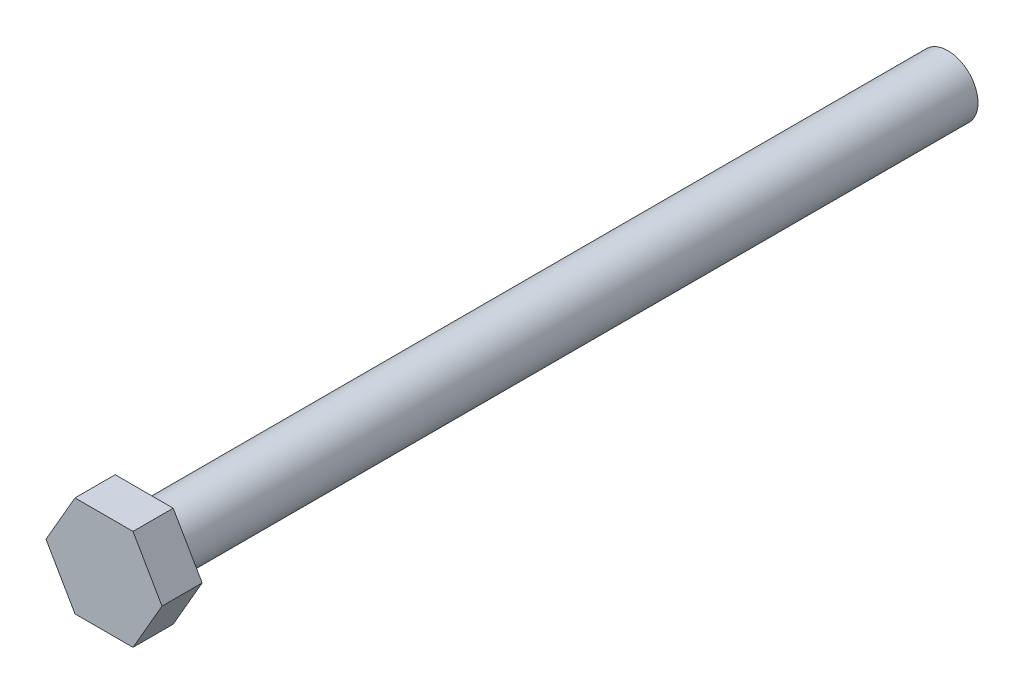
ISO-10303-21;
HEADER;
FILE_DESCRIPTION(('STEP AP214'),'2;1');
FILE_NAME('part.step','',(''),(''),'','','');
FILE_SCHEMA(('AUTOMOTIVE_DESIGN { 1 0 10303 214 1 1 1 1 }'));
ENDSEC;
DATA;
#1=APPLICATION_CONTEXT('core data for automotive mechanical design processes');
#2=APPLICATION_PROTOCOL_DEFINITION('international standard','automotive_design',2000,#1);
#3=PRODUCT_CONTEXT('',#1,'mechanical');
#4=PRODUCT('Part','Part','',(#3));
#5=PRODUCT_RELATED_PRODUCT_CATEGORY('part','',(#4));
#6=PRODUCT_DEFINITION_FORMATION('','',#4);
#7=PRODUCT_DEFINITION_CONTEXT('part definition',#1,'design');
#8=PRODUCT_DEFINITION('design','',#6,#7);
#9=PRODUCT_DEFINITION_SHAPE('','',#8);
#10=(LENGTH_UNIT() NAMED_UNIT(*) SI_UNIT(.MILLI.,.METRE.));
#11=(NAMED_UNIT(*) PLANE_ANGLE_UNIT() SI_UNIT($,.RADIAN.));
#12=(NAMED_UNIT(*) SI_UNIT($,.STERADIAN.) SOLID_ANGLE_UNIT());
#13=UNCERTAINTY_MEASURE_WITH_UNIT(LENGTH_MEASURE(1.E-05),#10,'distance_accuracy_value','');
#14=(GEOMETRIC_REPRESENTATION_CONTEXT(3) GLOBAL_UNCERTAINTY_ASSIGNED_CONTEXT((#13)) GLOBAL_UNIT_ASSIGNED_CONTEXT((#10,
#11,#12)) REPRESENTATION_CONTEXT('',''));
#15=CARTESIAN_POINT('',(0.,0.,0.));
#16=DIRECTION('',(0.,0.,1.));
#17=DIRECTION('',(1.,0.,0.));
#18=AXIS2_PLACEMENT_3D('',#15,#16,#17);
#19=CARTESIAN_POINT('',(0.,0.,-80.));
#20=DIRECTION('',(0.,0.,1.));
#21=DIRECTION('',(1.,0.,0.));
#22=AXIS2_PLACEMENT_3D('',#19,#20,#21);
#23=CYLINDRICAL_SURFACE('',#22,3.);
#24=CARTESIAN_POINT('',(0.,0.,-80.));
#25=DIRECTION('',(0.,0.,1.));
#26=DIRECTION('',(1.,0.,0.));
#27=AXIS2_PLACEMENT_3D('',#24,#25,#26);
#28=CIRCLE('',#27,3.);
#29=CARTESIAN_POINT('',(3.,0.,-80.));
#30=VERTEX_POINT('',#29);
#31=EDGE_CURVE('E11',#30,#30,#28,.T.);
#32=ORIENTED_EDGE('',*,*,#31,.T.);
#33=EDGE_LOOP('',(#32));
#34=FACE_BOUND('',#33,.T.);
#35=CARTESIAN_POINT('',(0.,0.,0.));
#36=DIRECTION('',(0.,0.,1.));
#37=DIRECTION('',(1.,0.,0.));
#38=AXIS2_PLACEMENT_3D('',#35,#36,#37);
#39=CIRCLE('',#38,3.);
#40=CARTESIAN_POINT('',(3.,0.,0.));
#41=VERTEX_POINT('',#40);
#42=EDGE_CURVE('E42',#41,#41,#39,.T.);
#43=ORIENTED_EDGE('',*,*,#42,.F.);
#44=EDGE_LOOP('',(#43));
#45=FACE_BOUND('',#44,.T.);
#46=ADVANCED_FACE('F39',(#34,#45),#23,.T.);
#47=CARTESIAN_POINT('',(0.,0.,-80.));
#48=DIRECTION('',(0.,0.,1.));
#49=DIRECTION('',(1.,0.,0.));
#50=AXIS2_PLACEMENT_3D('',#47,#48,#49);
#51=PLANE('',#50);
#52=ORIENTED_EDGE('',*,*,#31,.F.);
#53=EDGE_LOOP('',(#52));
#54=FACE_BOUND('',#53,.T.);
#55=ADVANCED_FACE('F150',(#54),#51,.F.);
#56=CARTESIAN_POINT('',(2.88675134594813,5.,4.));
#57=DIRECTION('',(0.,-1.,0.));
#58=DIRECTION('',(0.,0.,-1.));
#59=AXIS2_PLACEMENT_3D('',#56,#57,#58);
#60=PLANE('',#59);
#61=DIRECTION('',(-1.,0.,0.));
#62=VECTOR('',#61,1.);
#63=CARTESIAN_POINT('',(2.88675134594813,5.,0.));
#64=LINE('',#63,#62);
#65=CARTESIAN_POINT('',(2.88675134594813,5.,0.));
#66=VERTEX_POINT('',#65);
#67=CARTESIAN_POINT('',(-2.88675134594813,5.,0.));
#68=VERTEX_POINT('',#67);
#69=EDGE_CURVE('E124',#66,#68,#64,.T.);
#70=ORIENTED_EDGE('',*,*,#69,.T.);
#71=DIRECTION('',(0.,0.,-1.));
#72=VECTOR('',#71,1.);
#73=CARTESIAN_POINT('',(-2.88675134594813,5.,4.));
#74=LINE('',#73,#72);
#75=CARTESIAN_POINT('',(-2.88675134594813,5.,4.));
#76=VERTEX_POINT('',#75);
#77=EDGE_CURVE('E141',#76,#68,#74,.T.);
#78=ORIENTED_EDGE('',*,*,#77,.F.);
#79=DIRECTION('',(-1.,0.,0.));
#80=VECTOR('',#79,1.);
#81=CARTESIAN_POINT('',(2.88675134594813,5.,4.));
#82=LINE('',#81,#80);
#83=CARTESIAN_POINT('',(2.88675134594813,5.,4.));
#84=VERTEX_POINT('',#83);
#85=EDGE_CURVE('E134',#84,#76,#82,.T.);
#86=ORIENTED_EDGE('',*,*,#85,.F.);
#87=DIRECTION('',(0.,0.,-1.));
#88=VECTOR('',#87,1.);
#89=CARTESIAN_POINT('',(2.88675134594813,5.,4.));
#90=LINE('',#89,#88);
#91=EDGE_CURVE('E120',#84,#66,#90,.T.);
#92=ORIENTED_EDGE('',*,*,#91,.T.);
#93=EDGE_LOOP('',(#70,#78,#86,#92));
#94=FACE_BOUND('',#93,.T.);
#95=ADVANCED_FACE('F155',(#94),#60,.F.);
#96=CARTESIAN_POINT('',(-2.88675134594813,5.,4.));
#97=DIRECTION('',(0.866025403784439,-0.5,0.));
#98=DIRECTION('',(0.5,0.866025403784439,0.));
#99=AXIS2_PLACEMENT_3D('',#96,#97,#98);
#100=PLANE('',#99);
#101=DIRECTION('',(-0.5,-0.866025403784439,0.));
#102=VECTOR('',#101,1.);
#103=CARTESIAN_POINT('',(-2.88675134594813,5.,0.));
#104=LINE('',#103,#102);
#105=CARTESIAN_POINT('',(-5.77350269189626,0.,0.));
#106=VERTEX_POINT('',#105);
#107=EDGE_CURVE('E127',#68,#106,#104,.T.);
#108=ORIENTED_EDGE('',*,*,#107,.T.);
#109=DIRECTION('',(0.,0.,-1.));
#110=VECTOR('',#109,1.);
#111=CARTESIAN_POINT('',(-5.77350269189626,0.,4.));
#112=LINE('',#111,#110);
#113=CARTESIAN_POINT('',(-5.77350269189626,0.,4.));
#114=VERTEX_POINT('',#113);
#115=EDGE_CURVE('E138',#114,#106,#112,.T.);
#116=ORIENTED_EDGE('',*,*,#115,.F.);
#117=DIRECTION('',(-0.5,-0.866025403784439,0.));
#118=VECTOR('',#117,1.);
#119=CARTESIAN_POINT('',(-2.88675134594813,5.,4.));
#120=LINE('',#119,#118);
#121=EDGE_CURVE('E93',#76,#114,#120,.T.);
#122=ORIENTED_EDGE('',*,*,#121,.F.);
#123=ORIENTED_EDGE('',*,*,#77,.T.);
#124=EDGE_LOOP('',(#108,#116,#122,#123));
#125=FACE_BOUND('',#124,.T.);
#126=ADVANCED_FACE('F161',(#125),#100,.F.);
#127=CARTESIAN_POINT('',(-5.77350269189626,0.,4.));
#128=DIRECTION('',(0.866025403784439,0.5,0.));
#129=DIRECTION('',(-0.5,0.866025403784439,0.));
#130=AXIS2_PLACEMENT_3D('',#127,#128,#129);
#131=PLANE('',#130);
#132=DIRECTION('',(0.5,-0.866025403784439,0.));
#133=VECTOR('',#132,1.);
#134=CARTESIAN_POINT('',(-5.77350269189626,0.,0.));
#135=LINE('',#134,#133);
#136=CARTESIAN_POINT('',(-2.88675134594813,-5.,0.));
#137=VERTEX_POINT('',#136);
#138=EDGE_CURVE('E129',#106,#137,#135,.T.);
#139=ORIENTED_EDGE('',*,*,#138,.T.);
#140=DIRECTION('',(0.,0.,-1.));
#141=VECTOR('',#140,1.);
#142=CARTESIAN_POINT('',(-2.88675134594813,-5.,4.));
#143=LINE('',#142,#141);
#144=CARTESIAN_POINT('',(-2.88675134594813,-5.,4.));
#145=VERTEX_POINT('',#144);
#146=EDGE_CURVE('E115',#145,#137,#143,.T.);
#147=ORIENTED_EDGE('',*,*,#146,.F.);
#148=DIRECTION('',(0.5,-0.866025403784439,0.));
#149=VECTOR('',#148,1.);
#150=CARTESIAN_POINT('',(-5.77350269189626,0.,4.));
#151=LINE('',#150,#149);
#152=EDGE_CURVE('E106',#114,#145,#151,.T.);
#153=ORIENTED_EDGE('',*,*,#152,.F.);
#154=ORIENTED_EDGE('',*,*,#115,.T.);
#155=EDGE_LOOP('',(#139,#147,#153,#154));
#156=FACE_BOUND('',#155,.T.);
#157=ADVANCED_FACE('F167',(#156),#131,.F.);
#158=CARTESIAN_POINT('',(-2.88675134594813,-5.,4.));
#159=DIRECTION('',(0.,1.,0.));
#160=DIRECTION('',(0.,0.,1.));
#161=AXIS2_PLACEMENT_3D('',#158,#159,#160);
#162=PLANE('',#161);
#163=DIRECTION('',(1.,0.,0.));
#164=VECTOR('',#163,1.);
#165=CARTESIAN_POINT('',(-2.88675134594813,-5.,0.));
#166=LINE('',#165,#164);
#167=CARTESIAN_POINT('',(2.88675134594813,-5.,0.));
#168=VERTEX_POINT('',#167);
#169=EDGE_CURVE('E114',#137,#168,#166,.T.);
#170=ORIENTED_EDGE('',*,*,#169,.T.);
#171=DIRECTION('',(0.,0.,-1.));
#172=VECTOR('',#171,1.);
#173=CARTESIAN_POINT('',(2.88675134594813,-5.,4.));
#174=LINE('',#173,#172);
#175=CARTESIAN_POINT('',(2.88675134594813,-5.,4.));
#176=VERTEX_POINT('',#175);
#177=EDGE_CURVE('E111',#176,#168,#174,.T.);
#178=ORIENTED_EDGE('',*,*,#177,.F.);
#179=DIRECTION('',(1.,0.,0.));
#180=VECTOR('',#179,1.);
#181=CARTESIAN_POINT('',(-2.88675134594813,-5.,4.));
#182=LINE('',#181,#180);
#183=EDGE_CURVE('E100',#145,#176,#182,.T.);
#184=ORIENTED_EDGE('',*,*,#183,.F.);
#185=ORIENTED_EDGE('',*,*,#146,.T.);
#186=EDGE_LOOP('',(#170,#178,#184,#185));
#187=FACE_BOUND('',#186,.T.);
#188=ADVANCED_FACE('F112',(#187),#162,.F.);
#189=CARTESIAN_POINT('',(2.88675134594813,-5.,4.));
#190=DIRECTION('',(-0.866025403784439,0.5,0.));
#191=DIRECTION('',(-0.5,-0.866025403784439,0.));
#192=AXIS2_PLACEMENT_3D('',#189,#190,#191);
#193=PLANE('',#192);
#194=DIRECTION('',(0.5,0.866025403784439,0.));
#195=VECTOR('',#194,1.);
#196=CARTESIAN_POINT('',(2.88675134594813,-5.,0.));
#197=LINE('',#196,#195);
#198=CARTESIAN_POINT('',(5.77350269189626,0.,0.));
#199=VERTEX_POINT('',#198);
#200=EDGE_CURVE('E78',#168,#199,#197,.T.);
#201=ORIENTED_EDGE('',*,*,#200,.T.);
#202=DIRECTION('',(0.,0.,-1.));
#203=VECTOR('',#202,1.);
#204=CARTESIAN_POINT('',(5.77350269189626,0.,4.));
#205=LINE('',#204,#203);
#206=CARTESIAN_POINT('',(5.77350269189626,0.,4.));
#207=VERTEX_POINT('',#206);
#208=EDGE_CURVE('E116',#207,#199,#205,.T.);
#209=ORIENTED_EDGE('',*,*,#208,.F.);
#210=DIRECTION('',(0.5,0.866025403784439,0.));
#211=VECTOR('',#210,1.);
#212=CARTESIAN_POINT('',(2.88675134594813,-5.,4.));
#213=LINE('',#212,#211);
#214=EDGE_CURVE('E104',#176,#207,#213,.T.);
#215=ORIENTED_EDGE('',*,*,#214,.F.);
#216=ORIENTED_EDGE('',*,*,#177,.T.);
#217=EDGE_LOOP('',(#201,#209,#215,#216));
#218=FACE_BOUND('',#217,.T.);
#219=ADVANCED_FACE('F118',(#218),#193,.F.);
#220=CARTESIAN_POINT('',(5.77350269189626,0.,4.));
#221=DIRECTION('',(-0.866025403784439,-0.5,0.));
#222=DIRECTION('',(0.5,-0.866025403784439,0.));
#223=AXIS2_PLACEMENT_3D('',#220,#221,#222);
#224=PLANE('',#223);
#225=DIRECTION('',(-0.5,0.866025403784439,0.));
#226=VECTOR('',#225,1.);
#227=CARTESIAN_POINT('',(5.77350269189626,0.,0.));
#228=LINE('',#227,#226);
#229=EDGE_CURVE('E84',#199,#66,#228,.T.);
#230=ORIENTED_EDGE('',*,*,#229,.T.);
#231=ORIENTED_EDGE('',*,*,#91,.F.);
#232=DIRECTION('',(-0.5,0.866025403784439,0.));
#233=VECTOR('',#232,1.);
#234=CARTESIAN_POINT('',(5.77350269189626,0.,4.));
#235=LINE('',#234,#233);
#236=EDGE_CURVE('E55',#207,#84,#235,.T.);
#237=ORIENTED_EDGE('',*,*,#236,.F.);
#238=ORIENTED_EDGE('',*,*,#208,.T.);
#239=EDGE_LOOP('',(#230,#231,#237,#238));
#240=FACE_BOUND('',#239,.T.);
#241=ADVANCED_FACE('F175',(#240),#224,.F.);
#242=CARTESIAN_POINT('',(-8.66025403784439,5.,4.));
#243=DIRECTION('',(0.,0.,1.));
#244=DIRECTION('',(1.,0.,0.));
#245=AXIS2_PLACEMENT_3D('',#242,#243,#244);
#246=PLANE('',#245);
#247=ORIENTED_EDGE('',*,*,#85,.T.);
#248=ORIENTED_EDGE('',*,*,#121,.T.);
#249=ORIENTED_EDGE('',*,*,#152,.T.);
#250=ORIENTED_EDGE('',*,*,#183,.T.);
#251=ORIENTED_EDGE('',*,*,#214,.T.);
#252=ORIENTED_EDGE('',*,*,#236,.T.);
#253=EDGE_LOOP('',(#247,#248,#249,#250,#251,#252));
#254=FACE_BOUND('',#253,.T.);
#255=ADVANCED_FACE('F102',(#254),#246,.T.);
#256=CARTESIAN_POINT('',(-8.66025403784439,5.,0.));
#257=DIRECTION('',(0.,0.,1.));
#258=DIRECTION('',(1.,0.,0.));
#259=AXIS2_PLACEMENT_3D('',#256,#257,#258);
#260=PLANE('',#259);
#261=ORIENTED_EDGE('',*,*,#42,.T.);
#262=EDGE_LOOP('',(#261));
#263=FACE_BOUND('',#262,.T.);
#264=ORIENTED_EDGE('',*,*,#69,.F.);
#265=ORIENTED_EDGE('',*,*,#229,.F.);
#266=ORIENTED_EDGE('',*,*,#200,.F.);
#267=ORIENTED_EDGE('',*,*,#169,.F.);
#268=ORIENTED_EDGE('',*,*,#138,.F.);
#269=ORIENTED_EDGE('',*,*,#107,.F.);
#270=EDGE_LOOP('',(#264,#265,#266,#267,#268,#269));
#271=FACE_BOUND('',#270,.T.);
#272=ADVANCED_FACE('F146',(#263,#271),#260,.F.);
#273=CLOSED_SHELL('',(#46,#55,#95,#126,#157,#188,#219,#241,#255,#272));
#274=MANIFOLD_SOLID_BREP('B2',#273);
#275=ADVANCED_BREP_SHAPE_REPRESENTATION('',(#18,#274),#14);
#276=SHAPE_DEFINITION_REPRESENTATION(#9,#275);
ENDSEC;
END-ISO-10303-21;
